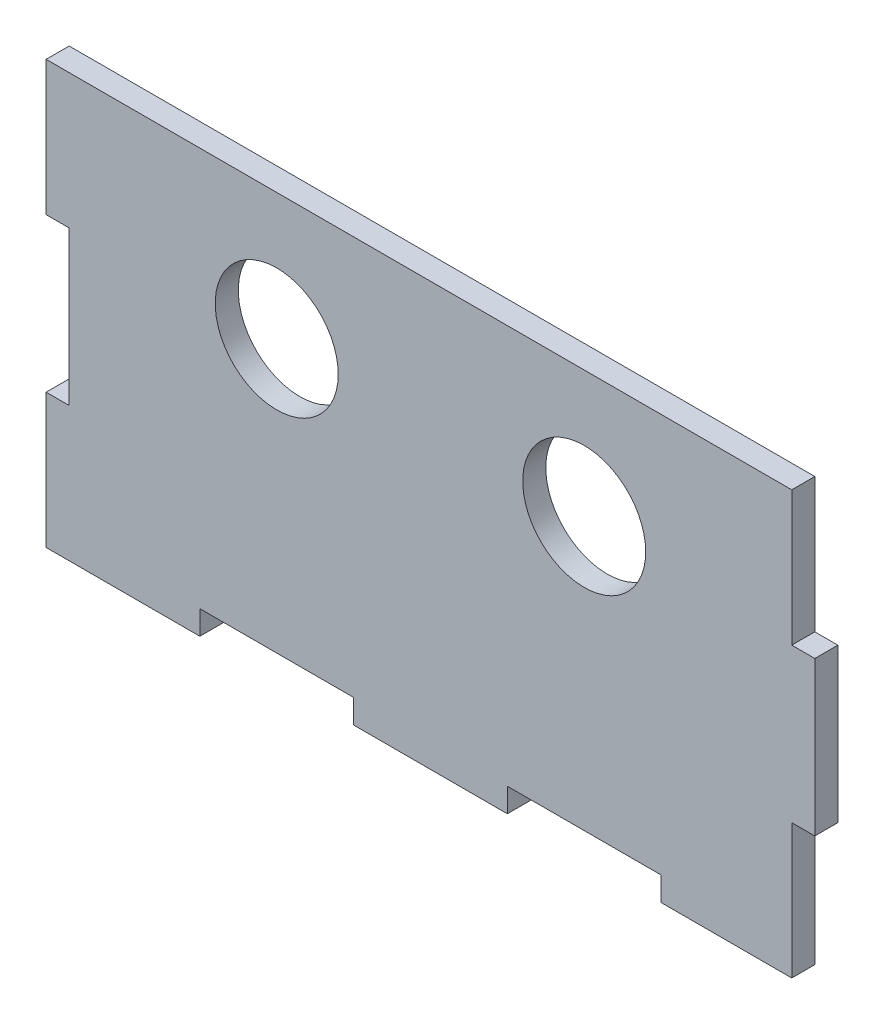
ISO-10303-21;
HEADER;
FILE_DESCRIPTION(('STEP AP214'),'2;1');
FILE_NAME('part.step','',(''),(''),'','','');
FILE_SCHEMA(('AUTOMOTIVE_DESIGN { 1 0 10303 214 1 1 1 1 }'));
ENDSEC;
DATA;
#1=APPLICATION_CONTEXT('core data for automotive mechanical design processes');
#2=APPLICATION_PROTOCOL_DEFINITION('international standard','automotive_design',2000,#1);
#3=PRODUCT_CONTEXT('',#1,'mechanical');
#4=PRODUCT('Part','Part','',(#3));
#5=PRODUCT_RELATED_PRODUCT_CATEGORY('part','',(#4));
#6=PRODUCT_DEFINITION_FORMATION('','',#4);
#7=PRODUCT_DEFINITION_CONTEXT('part definition',#1,'design');
#8=PRODUCT_DEFINITION('design','',#6,#7);
#9=PRODUCT_DEFINITION_SHAPE('','',#8);
#10=(LENGTH_UNIT() NAMED_UNIT(*) SI_UNIT(.MILLI.,.METRE.));
#11=(NAMED_UNIT(*) PLANE_ANGLE_UNIT() SI_UNIT($,.RADIAN.));
#12=(NAMED_UNIT(*) SI_UNIT($,.STERADIAN.) SOLID_ANGLE_UNIT());
#13=UNCERTAINTY_MEASURE_WITH_UNIT(LENGTH_MEASURE(1.E-05),#10,'distance_accuracy_value','');
#14=(GEOMETRIC_REPRESENTATION_CONTEXT(3) GLOBAL_UNCERTAINTY_ASSIGNED_CONTEXT((#13)) GLOBAL_UNIT_ASSIGNED_CONTEXT((#10,
#11,#12)) REPRESENTATION_CONTEXT('',''));
#15=CARTESIAN_POINT('',(0.,0.,0.));
#16=DIRECTION('',(0.,0.,1.));
#17=DIRECTION('',(1.,0.,0.));
#18=AXIS2_PLACEMENT_3D('',#15,#16,#17);
#19=CARTESIAN_POINT('',(0.,-24.3935030371176,3.));
#20=DIRECTION('',(0.,1.,0.));
#21=DIRECTION('',(0.,0.,1.));
#22=AXIS2_PLACEMENT_3D('',#19,#20,#21);
#23=PLANE('',#22);
#24=DIRECTION('',(1.,0.,0.));
#25=VECTOR('',#24,1.);
#26=CARTESIAN_POINT('',(0.,-24.3935030371176,0.));
#27=LINE('',#26,#25);
#28=CARTESIAN_POINT('',(10.,-24.3935030371176,0.));
#29=VERTEX_POINT('',#28);
#30=CARTESIAN_POINT('',(30.,-24.3935030371176,0.));
#31=VERTEX_POINT('',#30);
#32=EDGE_CURVE('E281',#29,#31,#27,.T.);
#33=ORIENTED_EDGE('',*,*,#32,.T.);
#34=DIRECTION('',(0.,0.,-1.));
#35=VECTOR('',#34,1.);
#36=CARTESIAN_POINT('',(30.,-24.3935030371176,3.));
#37=LINE('',#36,#35);
#38=CARTESIAN_POINT('',(30.,-24.3935030371176,3.));
#39=VERTEX_POINT('',#38);
#40=EDGE_CURVE('E11',#39,#31,#37,.T.);
#41=ORIENTED_EDGE('',*,*,#40,.F.);
#42=DIRECTION('',(1.,0.,0.));
#43=VECTOR('',#42,1.);
#44=CARTESIAN_POINT('',(0.,-24.3935030371176,3.));
#45=LINE('',#44,#43);
#46=CARTESIAN_POINT('',(10.,-24.3935030371176,3.));
#47=VERTEX_POINT('',#46);
#48=EDGE_CURVE('E215',#47,#39,#45,.T.);
#49=ORIENTED_EDGE('',*,*,#48,.F.);
#50=DIRECTION('',(0.,0.,-1.));
#51=VECTOR('',#50,1.);
#52=CARTESIAN_POINT('',(10.,-24.3935030371176,3.));
#53=LINE('',#52,#51);
#54=EDGE_CURVE('E203',#47,#29,#53,.T.);
#55=ORIENTED_EDGE('',*,*,#54,.T.);
#56=EDGE_LOOP('',(#33,#41,#49,#55));
#57=FACE_BOUND('',#56,.T.);
#58=ADVANCED_FACE('F36',(#57),#23,.F.);
#59=CARTESIAN_POINT('',(30.,0.,3.));
#60=DIRECTION('',(1.,0.,0.));
#61=DIRECTION('',(0.,0.,-1.));
#62=AXIS2_PLACEMENT_3D('',#59,#60,#61);
#63=PLANE('',#62);
#64=DIRECTION('',(0.,-1.,0.));
#65=VECTOR('',#64,1.);
#66=CARTESIAN_POINT('',(30.,0.,0.));
#67=LINE('',#66,#65);
#68=CARTESIAN_POINT('',(30.,-27.5,0.));
#69=VERTEX_POINT('',#68);
#70=EDGE_CURVE('E275',#31,#69,#67,.T.);
#71=ORIENTED_EDGE('',*,*,#70,.T.);
#72=DIRECTION('',(0.,0.,-1.));
#73=VECTOR('',#72,1.);
#74=CARTESIAN_POINT('',(30.,-27.5,3.));
#75=LINE('',#74,#73);
#76=CARTESIAN_POINT('',(30.,-27.5,3.));
#77=VERTEX_POINT('',#76);
#78=EDGE_CURVE('E45',#77,#69,#75,.T.);
#79=ORIENTED_EDGE('',*,*,#78,.F.);
#80=DIRECTION('',(0.,-1.,0.));
#81=VECTOR('',#80,1.);
#82=CARTESIAN_POINT('',(30.,0.,3.));
#83=LINE('',#82,#81);
#84=EDGE_CURVE('E132',#39,#77,#83,.T.);
#85=ORIENTED_EDGE('',*,*,#84,.F.);
#86=ORIENTED_EDGE('',*,*,#40,.T.);
#87=EDGE_LOOP('',(#71,#79,#85,#86));
#88=FACE_BOUND('',#87,.T.);
#89=ADVANCED_FACE('F405',(#88),#63,.F.);
#90=CARTESIAN_POINT('',(0.,-27.5,3.));
#91=DIRECTION('',(0.,1.,0.));
#92=DIRECTION('',(0.,0.,1.));
#93=AXIS2_PLACEMENT_3D('',#90,#91,#92);
#94=PLANE('',#93);
#95=DIRECTION('',(1.,0.,0.));
#96=VECTOR('',#95,1.);
#97=CARTESIAN_POINT('',(0.,-27.5,0.));
#98=LINE('',#97,#96);
#99=CARTESIAN_POINT('',(47.,-27.5,0.));
#100=VERTEX_POINT('',#99);
#101=EDGE_CURVE('E228',#69,#100,#98,.T.);
#102=ORIENTED_EDGE('',*,*,#101,.T.);
#103=DIRECTION('',(0.,0.,-1.));
#104=VECTOR('',#103,1.);
#105=CARTESIAN_POINT('',(47.,-27.5,3.));
#106=LINE('',#105,#104);
#107=CARTESIAN_POINT('',(47.,-27.5,3.));
#108=VERTEX_POINT('',#107);
#109=EDGE_CURVE('E265',#108,#100,#106,.T.);
#110=ORIENTED_EDGE('',*,*,#109,.F.);
#111=DIRECTION('',(1.,0.,0.));
#112=VECTOR('',#111,1.);
#113=CARTESIAN_POINT('',(0.,-27.5,3.));
#114=LINE('',#113,#112);
#115=EDGE_CURVE('E202',#77,#108,#114,.T.);
#116=ORIENTED_EDGE('',*,*,#115,.F.);
#117=ORIENTED_EDGE('',*,*,#78,.T.);
#118=EDGE_LOOP('',(#102,#110,#116,#117));
#119=FACE_BOUND('',#118,.T.);
#120=ADVANCED_FACE('F270',(#119),#94,.F.);
#121=CARTESIAN_POINT('',(47.,0.,3.));
#122=DIRECTION('',(1.,0.,0.));
#123=DIRECTION('',(0.,0.,-1.));
#124=AXIS2_PLACEMENT_3D('',#121,#122,#123);
#125=PLANE('',#124);
#126=DIRECTION('',(0.,-1.,0.));
#127=VECTOR('',#126,1.);
#128=CARTESIAN_POINT('',(47.,0.,0.));
#129=LINE('',#128,#127);
#130=CARTESIAN_POINT('',(47.,-10.,0.));
#131=VERTEX_POINT('',#130);
#132=EDGE_CURVE('E278',#131,#100,#129,.T.);
#133=ORIENTED_EDGE('',*,*,#132,.F.);
#134=DIRECTION('',(0.,0.,-1.));
#135=VECTOR('',#134,1.);
#136=CARTESIAN_POINT('',(47.,-10.,3.));
#137=LINE('',#136,#135);
#138=CARTESIAN_POINT('',(47.,-10.,3.));
#139=VERTEX_POINT('',#138);
#140=EDGE_CURVE('E263',#139,#131,#137,.T.);
#141=ORIENTED_EDGE('',*,*,#140,.F.);
#142=DIRECTION('',(0.,-1.,0.));
#143=VECTOR('',#142,1.);
#144=CARTESIAN_POINT('',(47.,0.,3.));
#145=LINE('',#144,#143);
#146=EDGE_CURVE('E209',#139,#108,#145,.T.);
#147=ORIENTED_EDGE('',*,*,#146,.T.);
#148=ORIENTED_EDGE('',*,*,#109,.T.);
#149=EDGE_LOOP('',(#133,#141,#147,#148));
#150=FACE_BOUND('',#149,.T.);
#151=ADVANCED_FACE('F347',(#150),#125,.T.);
#152=CARTESIAN_POINT('',(0.,-10.,3.));
#153=DIRECTION('',(0.,-1.,0.));
#154=DIRECTION('',(0.,0.,-1.));
#155=AXIS2_PLACEMENT_3D('',#152,#153,#154);
#156=PLANE('',#155);
#157=DIRECTION('',(-1.,0.,0.));
#158=VECTOR('',#157,1.);
#159=CARTESIAN_POINT('',(0.,-10.,0.));
#160=LINE('',#159,#158);
#161=CARTESIAN_POINT('',(50.,-10.,0.));
#162=VERTEX_POINT('',#161);
#163=EDGE_CURVE('E279',#162,#131,#160,.T.);
#164=ORIENTED_EDGE('',*,*,#163,.F.);
#165=DIRECTION('',(0.,0.,-1.));
#166=VECTOR('',#165,1.);
#167=CARTESIAN_POINT('',(50.,-10.,3.));
#168=LINE('',#167,#166);
#169=CARTESIAN_POINT('',(50.,-10.,3.));
#170=VERTEX_POINT('',#169);
#171=EDGE_CURVE('E261',#170,#162,#168,.T.);
#172=ORIENTED_EDGE('',*,*,#171,.F.);
#173=DIRECTION('',(-1.,0.,0.));
#174=VECTOR('',#173,1.);
#175=CARTESIAN_POINT('',(0.,-10.,3.));
#176=LINE('',#175,#174);
#177=EDGE_CURVE('E214',#170,#139,#176,.T.);
#178=ORIENTED_EDGE('',*,*,#177,.T.);
#179=ORIENTED_EDGE('',*,*,#140,.T.);
#180=EDGE_LOOP('',(#164,#172,#178,#179));
#181=FACE_BOUND('',#180,.T.);
#182=ADVANCED_FACE('F343',(#181),#156,.T.);
#183=CARTESIAN_POINT('',(50.,0.,3.));
#184=DIRECTION('',(-1.,0.,0.));
#185=DIRECTION('',(0.,0.,1.));
#186=AXIS2_PLACEMENT_3D('',#183,#184,#185);
#187=PLANE('',#186);
#188=DIRECTION('',(0.,1.,0.));
#189=VECTOR('',#188,1.);
#190=CARTESIAN_POINT('',(50.,0.,0.));
#191=LINE('',#190,#189);
#192=CARTESIAN_POINT('',(50.,10.,0.));
#193=VERTEX_POINT('',#192);
#194=EDGE_CURVE('E350',#162,#193,#191,.T.);
#195=ORIENTED_EDGE('',*,*,#194,.T.);
#196=DIRECTION('',(0.,0.,-1.));
#197=VECTOR('',#196,1.);
#198=CARTESIAN_POINT('',(50.,10.,3.));
#199=LINE('',#198,#197);
#200=CARTESIAN_POINT('',(50.,10.,3.));
#201=VERTEX_POINT('',#200);
#202=EDGE_CURVE('E258',#201,#193,#199,.T.);
#203=ORIENTED_EDGE('',*,*,#202,.F.);
#204=DIRECTION('',(0.,1.,0.));
#205=VECTOR('',#204,1.);
#206=CARTESIAN_POINT('',(50.,0.,3.));
#207=LINE('',#206,#205);
#208=EDGE_CURVE('E337',#170,#201,#207,.T.);
#209=ORIENTED_EDGE('',*,*,#208,.F.);
#210=ORIENTED_EDGE('',*,*,#171,.T.);
#211=EDGE_LOOP('',(#195,#203,#209,#210));
#212=FACE_BOUND('',#211,.T.);
#213=ADVANCED_FACE('F395',(#212),#187,.F.);
#214=CARTESIAN_POINT('',(0.,10.,3.));
#215=DIRECTION('',(0.,-1.,0.));
#216=DIRECTION('',(0.,0.,-1.));
#217=AXIS2_PLACEMENT_3D('',#214,#215,#216);
#218=PLANE('',#217);
#219=DIRECTION('',(-1.,0.,0.));
#220=VECTOR('',#219,1.);
#221=CARTESIAN_POINT('',(0.,10.,0.));
#222=LINE('',#221,#220);
#223=CARTESIAN_POINT('',(47.,10.,0.));
#224=VERTEX_POINT('',#223);
#225=EDGE_CURVE('E352',#193,#224,#222,.T.);
#226=ORIENTED_EDGE('',*,*,#225,.T.);
#227=DIRECTION('',(0.,0.,-1.));
#228=VECTOR('',#227,1.);
#229=CARTESIAN_POINT('',(47.,10.,3.));
#230=LINE('',#229,#228);
#231=CARTESIAN_POINT('',(47.,10.,3.));
#232=VERTEX_POINT('',#231);
#233=EDGE_CURVE('E255',#232,#224,#230,.T.);
#234=ORIENTED_EDGE('',*,*,#233,.F.);
#235=DIRECTION('',(-1.,0.,0.));
#236=VECTOR('',#235,1.);
#237=CARTESIAN_POINT('',(0.,10.,3.));
#238=LINE('',#237,#236);
#239=EDGE_CURVE('E335',#201,#232,#238,.T.);
#240=ORIENTED_EDGE('',*,*,#239,.F.);
#241=ORIENTED_EDGE('',*,*,#202,.T.);
#242=EDGE_LOOP('',(#226,#234,#240,#241));
#243=FACE_BOUND('',#242,.T.);
#244=ADVANCED_FACE('F393',(#243),#218,.F.);
#245=CARTESIAN_POINT('',(47.,0.,3.));
#246=DIRECTION('',(-1.,0.,0.));
#247=DIRECTION('',(0.,0.,1.));
#248=AXIS2_PLACEMENT_3D('',#245,#246,#247);
#249=PLANE('',#248);
#250=DIRECTION('',(0.,1.,0.));
#251=VECTOR('',#250,1.);
#252=CARTESIAN_POINT('',(47.,0.,0.));
#253=LINE('',#252,#251);
#254=CARTESIAN_POINT('',(47.,27.5,0.));
#255=VERTEX_POINT('',#254);
#256=EDGE_CURVE('E356',#224,#255,#253,.T.);
#257=ORIENTED_EDGE('',*,*,#256,.T.);
#258=DIRECTION('',(0.,0.,-1.));
#259=VECTOR('',#258,1.);
#260=CARTESIAN_POINT('',(47.,27.5,3.));
#261=LINE('',#260,#259);
#262=CARTESIAN_POINT('',(47.,27.5,3.));
#263=VERTEX_POINT('',#262);
#264=EDGE_CURVE('E253',#263,#255,#261,.T.);
#265=ORIENTED_EDGE('',*,*,#264,.F.);
#266=DIRECTION('',(0.,1.,0.));
#267=VECTOR('',#266,1.);
#268=CARTESIAN_POINT('',(47.,0.,3.));
#269=LINE('',#268,#267);
#270=EDGE_CURVE('E333',#232,#263,#269,.T.);
#271=ORIENTED_EDGE('',*,*,#270,.F.);
#272=ORIENTED_EDGE('',*,*,#233,.T.);
#273=EDGE_LOOP('',(#257,#265,#271,#272));
#274=FACE_BOUND('',#273,.T.);
#275=ADVANCED_FACE('F389',(#274),#249,.F.);
#276=CARTESIAN_POINT('',(0.,27.5,3.));
#277=DIRECTION('',(0.,1.,0.));
#278=DIRECTION('',(0.,0.,1.));
#279=AXIS2_PLACEMENT_3D('',#276,#277,#278);
#280=PLANE('',#279);
#281=DIRECTION('',(1.,0.,0.));
#282=VECTOR('',#281,1.);
#283=CARTESIAN_POINT('',(0.,27.5,0.));
#284=LINE('',#283,#282);
#285=CARTESIAN_POINT('',(-50.,27.5,0.));
#286=VERTEX_POINT('',#285);
#287=EDGE_CURVE('E359',#286,#255,#284,.T.);
#288=ORIENTED_EDGE('',*,*,#287,.F.);
#289=DIRECTION('',(0.,0.,-1.));
#290=VECTOR('',#289,1.);
#291=CARTESIAN_POINT('',(-50.,27.5,3.));
#292=LINE('',#291,#290);
#293=CARTESIAN_POINT('',(-50.,27.5,3.));
#294=VERTEX_POINT('',#293);
#295=EDGE_CURVE('E251',#294,#286,#292,.T.);
#296=ORIENTED_EDGE('',*,*,#295,.F.);
#297=DIRECTION('',(1.,0.,0.));
#298=VECTOR('',#297,1.);
#299=CARTESIAN_POINT('',(0.,27.5,3.));
#300=LINE('',#299,#298);
#301=EDGE_CURVE('E330',#294,#263,#300,.T.);
#302=ORIENTED_EDGE('',*,*,#301,.T.);
#303=ORIENTED_EDGE('',*,*,#264,.T.);
#304=EDGE_LOOP('',(#288,#296,#302,#303));
#305=FACE_BOUND('',#304,.T.);
#306=ADVANCED_FACE('F384',(#305),#280,.T.);
#307=CARTESIAN_POINT('',(-50.,0.,3.));
#308=DIRECTION('',(-1.,0.,0.));
#309=DIRECTION('',(0.,0.,1.));
#310=AXIS2_PLACEMENT_3D('',#307,#308,#309);
#311=PLANE('',#310);
#312=DIRECTION('',(0.,1.,0.));
#313=VECTOR('',#312,1.);
#314=CARTESIAN_POINT('',(-50.,0.,0.));
#315=LINE('',#314,#313);
#316=CARTESIAN_POINT('',(-50.,10.,0.));
#317=VERTEX_POINT('',#316);
#318=EDGE_CURVE('E362',#317,#286,#315,.T.);
#319=ORIENTED_EDGE('',*,*,#318,.F.);
#320=DIRECTION('',(0.,0.,-1.));
#321=VECTOR('',#320,1.);
#322=CARTESIAN_POINT('',(-50.,10.,3.));
#323=LINE('',#322,#321);
#324=CARTESIAN_POINT('',(-50.,10.,3.));
#325=VERTEX_POINT('',#324);
#326=EDGE_CURVE('E249',#325,#317,#323,.T.);
#327=ORIENTED_EDGE('',*,*,#326,.F.);
#328=DIRECTION('',(0.,1.,0.));
#329=VECTOR('',#328,1.);
#330=CARTESIAN_POINT('',(-50.,0.,3.));
#331=LINE('',#330,#329);
#332=EDGE_CURVE('E327',#325,#294,#331,.T.);
#333=ORIENTED_EDGE('',*,*,#332,.T.);
#334=ORIENTED_EDGE('',*,*,#295,.T.);
#335=EDGE_LOOP('',(#319,#327,#333,#334));
#336=FACE_BOUND('',#335,.T.);
#337=ADVANCED_FACE('F380',(#336),#311,.T.);
#338=CARTESIAN_POINT('',(0.,10.0000000000001,3.));
#339=DIRECTION('',(0.,-1.,0.));
#340=DIRECTION('',(1.,0.,0.));
#341=AXIS2_PLACEMENT_3D('',#338,#339,#340);
#342=PLANE('',#341);
#343=DIRECTION('',(-1.,0.,0.));
#344=VECTOR('',#343,1.);
#345=CARTESIAN_POINT('',(0.,10.0000000000001,0.));
#346=LINE('',#345,#344);
#347=CARTESIAN_POINT('',(-47.,10.,0.));
#348=VERTEX_POINT('',#347);
#349=EDGE_CURVE('E365',#348,#317,#346,.T.);
#350=ORIENTED_EDGE('',*,*,#349,.F.);
#351=DIRECTION('',(0.,0.,-1.));
#352=VECTOR('',#351,1.);
#353=CARTESIAN_POINT('',(-47.,10.,3.));
#354=LINE('',#353,#352);
#355=CARTESIAN_POINT('',(-47.,10.,3.));
#356=VERTEX_POINT('',#355);
#357=EDGE_CURVE('E247',#356,#348,#354,.T.);
#358=ORIENTED_EDGE('',*,*,#357,.F.);
#359=DIRECTION('',(-1.,0.,0.));
#360=VECTOR('',#359,1.);
#361=CARTESIAN_POINT('',(0.,10.0000000000001,3.));
#362=LINE('',#361,#360);
#363=EDGE_CURVE('E324',#356,#325,#362,.T.);
#364=ORIENTED_EDGE('',*,*,#363,.T.);
#365=ORIENTED_EDGE('',*,*,#326,.T.);
#366=EDGE_LOOP('',(#350,#358,#364,#365));
#367=FACE_BOUND('',#366,.T.);
#368=ADVANCED_FACE('F376',(#367),#342,.T.);
#369=CARTESIAN_POINT('',(-47.,0.,3.));
#370=DIRECTION('',(-1.,0.,0.));
#371=DIRECTION('',(0.,0.,1.));
#372=AXIS2_PLACEMENT_3D('',#369,#370,#371);
#373=PLANE('',#372);
#374=DIRECTION('',(0.,1.,0.));
#375=VECTOR('',#374,1.);
#376=CARTESIAN_POINT('',(-47.,0.,0.));
#377=LINE('',#376,#375);
#378=CARTESIAN_POINT('',(-47.,-10.,0.));
#379=VERTEX_POINT('',#378);
#380=EDGE_CURVE('E295',#379,#348,#377,.T.);
#381=ORIENTED_EDGE('',*,*,#380,.F.);
#382=DIRECTION('',(0.,0.,-1.));
#383=VECTOR('',#382,1.);
#384=CARTESIAN_POINT('',(-47.,-10.,3.));
#385=LINE('',#384,#383);
#386=CARTESIAN_POINT('',(-47.,-10.,3.));
#387=VERTEX_POINT('',#386);
#388=EDGE_CURVE('E245',#387,#379,#385,.T.);
#389=ORIENTED_EDGE('',*,*,#388,.F.);
#390=DIRECTION('',(0.,1.,0.));
#391=VECTOR('',#390,1.);
#392=CARTESIAN_POINT('',(-47.,0.,3.));
#393=LINE('',#392,#391);
#394=EDGE_CURVE('E321',#387,#356,#393,.T.);
#395=ORIENTED_EDGE('',*,*,#394,.T.);
#396=ORIENTED_EDGE('',*,*,#357,.T.);
#397=EDGE_LOOP('',(#381,#389,#395,#396));
#398=FACE_BOUND('',#397,.T.);
#399=ADVANCED_FACE('F372',(#398),#373,.T.);
#400=CARTESIAN_POINT('',(0.,-10.0000000000002,3.));
#401=DIRECTION('',(0.,1.,0.));
#402=DIRECTION('',(-1.,0.,0.));
#403=AXIS2_PLACEMENT_3D('',#400,#401,#402);
#404=PLANE('',#403);
#405=DIRECTION('',(1.,0.,0.));
#406=VECTOR('',#405,1.);
#407=CARTESIAN_POINT('',(0.,-10.0000000000002,0.));
#408=LINE('',#407,#406);
#409=CARTESIAN_POINT('',(-50.,-10.,0.));
#410=VERTEX_POINT('',#409);
#411=EDGE_CURVE('E291',#410,#379,#408,.T.);
#412=ORIENTED_EDGE('',*,*,#411,.F.);
#413=DIRECTION('',(0.,0.,-1.));
#414=VECTOR('',#413,1.);
#415=CARTESIAN_POINT('',(-50.,-10.,3.));
#416=LINE('',#415,#414);
#417=CARTESIAN_POINT('',(-50.,-10.,3.));
#418=VERTEX_POINT('',#417);
#419=EDGE_CURVE('E243',#418,#410,#416,.T.);
#420=ORIENTED_EDGE('',*,*,#419,.F.);
#421=DIRECTION('',(1.,0.,0.));
#422=VECTOR('',#421,1.);
#423=CARTESIAN_POINT('',(0.,-10.0000000000002,3.));
#424=LINE('',#423,#422);
#425=EDGE_CURVE('E318',#418,#387,#424,.T.);
#426=ORIENTED_EDGE('',*,*,#425,.T.);
#427=ORIENTED_EDGE('',*,*,#388,.T.);
#428=EDGE_LOOP('',(#412,#420,#426,#427));
#429=FACE_BOUND('',#428,.T.);
#430=ADVANCED_FACE('F448',(#429),#404,.T.);
#431=CARTESIAN_POINT('',(-50.,0.,3.));
#432=DIRECTION('',(-1.,0.,0.));
#433=DIRECTION('',(0.,0.,1.));
#434=AXIS2_PLACEMENT_3D('',#431,#432,#433);
#435=PLANE('',#434);
#436=DIRECTION('',(0.,1.,0.));
#437=VECTOR('',#436,1.);
#438=CARTESIAN_POINT('',(-50.,0.,0.));
#439=LINE('',#438,#437);
#440=CARTESIAN_POINT('',(-50.,-27.5,0.));
#441=VERTEX_POINT('',#440);
#442=EDGE_CURVE('E284',#441,#410,#439,.T.);
#443=ORIENTED_EDGE('',*,*,#442,.F.);
#444=DIRECTION('',(0.,0.,-1.));
#445=VECTOR('',#444,1.);
#446=CARTESIAN_POINT('',(-50.,-27.5,3.));
#447=LINE('',#446,#445);
#448=CARTESIAN_POINT('',(-50.,-27.5,3.));
#449=VERTEX_POINT('',#448);
#450=EDGE_CURVE('E241',#449,#441,#447,.T.);
#451=ORIENTED_EDGE('',*,*,#450,.F.);
#452=DIRECTION('',(0.,1.,0.));
#453=VECTOR('',#452,1.);
#454=CARTESIAN_POINT('',(-50.,0.,3.));
#455=LINE('',#454,#453);
#456=EDGE_CURVE('E208',#449,#418,#455,.T.);
#457=ORIENTED_EDGE('',*,*,#456,.T.);
#458=ORIENTED_EDGE('',*,*,#419,.T.);
#459=EDGE_LOOP('',(#443,#451,#457,#458));
#460=FACE_BOUND('',#459,.T.);
#461=ADVANCED_FACE('F445',(#460),#435,.T.);
#462=CARTESIAN_POINT('',(-30.,-27.5,0.));
#463=VERTEX_POINT('',#462);
#464=EDGE_CURVE('E227',#441,#463,#98,.T.);
#465=ORIENTED_EDGE('',*,*,#464,.T.);
#466=DIRECTION('',(0.,0.,-1.));
#467=VECTOR('',#466,1.);
#468=CARTESIAN_POINT('',(-30.,-27.5,3.));
#469=LINE('',#468,#467);
#470=CARTESIAN_POINT('',(-30.,-27.5,3.));
#471=VERTEX_POINT('',#470);
#472=EDGE_CURVE('E238',#471,#463,#469,.T.);
#473=ORIENTED_EDGE('',*,*,#472,.F.);
#474=EDGE_CURVE('E201',#449,#471,#114,.T.);
#475=ORIENTED_EDGE('',*,*,#474,.F.);
#476=ORIENTED_EDGE('',*,*,#450,.T.);
#477=EDGE_LOOP('',(#465,#473,#475,#476));
#478=FACE_BOUND('',#477,.T.);
#479=ADVANCED_FACE('F421',(#478),#94,.F.);
#480=CARTESIAN_POINT('',(-30.,0.,3.));
#481=DIRECTION('',(-1.,0.,0.));
#482=DIRECTION('',(0.,0.,1.));
#483=AXIS2_PLACEMENT_3D('',#480,#481,#482);
#484=PLANE('',#483);
#485=DIRECTION('',(0.,1.,0.));
#486=VECTOR('',#485,1.);
#487=CARTESIAN_POINT('',(-30.,0.,0.));
#488=LINE('',#487,#486);
#489=CARTESIAN_POINT('',(-30.,-24.3935030371176,0.));
#490=VERTEX_POINT('',#489);
#491=EDGE_CURVE('E283',#463,#490,#488,.T.);
#492=ORIENTED_EDGE('',*,*,#491,.T.);
#493=DIRECTION('',(0.,0.,-1.));
#494=VECTOR('',#493,1.);
#495=CARTESIAN_POINT('',(-30.,-24.3935030371176,3.));
#496=LINE('',#495,#494);
#497=CARTESIAN_POINT('',(-30.,-24.3935030371176,3.));
#498=VERTEX_POINT('',#497);
#499=EDGE_CURVE('E235',#498,#490,#496,.T.);
#500=ORIENTED_EDGE('',*,*,#499,.F.);
#501=DIRECTION('',(0.,1.,0.));
#502=VECTOR('',#501,1.);
#503=CARTESIAN_POINT('',(-30.,0.,3.));
#504=LINE('',#503,#502);
#505=EDGE_CURVE('E207',#471,#498,#504,.T.);
#506=ORIENTED_EDGE('',*,*,#505,.F.);
#507=ORIENTED_EDGE('',*,*,#472,.T.);
#508=EDGE_LOOP('',(#492,#500,#506,#507));
#509=FACE_BOUND('',#508,.T.);
#510=ADVANCED_FACE('F441',(#509),#484,.F.);
#511=CARTESIAN_POINT('',(0.,-24.3935030371176,3.));
#512=DIRECTION('',(0.,1.,0.));
#513=DIRECTION('',(0.,0.,1.));
#514=AXIS2_PLACEMENT_3D('',#511,#512,#513);
#515=PLANE('',#514);
#516=DIRECTION('',(1.,0.,0.));
#517=VECTOR('',#516,1.);
#518=CARTESIAN_POINT('',(0.,-24.3935030371176,0.));
#519=LINE('',#518,#517);
#520=CARTESIAN_POINT('',(-10.,-24.3935030371176,0.));
#521=VERTEX_POINT('',#520);
#522=EDGE_CURVE('E288',#490,#521,#519,.T.);
#523=ORIENTED_EDGE('',*,*,#522,.T.);
#524=DIRECTION('',(0.,0.,-1.));
#525=VECTOR('',#524,1.);
#526=CARTESIAN_POINT('',(-10.,-24.3935030371176,3.));
#527=LINE('',#526,#525);
#528=CARTESIAN_POINT('',(-10.,-24.3935030371176,3.));
#529=VERTEX_POINT('',#528);
#530=EDGE_CURVE('E196',#529,#521,#527,.T.);
#531=ORIENTED_EDGE('',*,*,#530,.F.);
#532=DIRECTION('',(1.,0.,0.));
#533=VECTOR('',#532,1.);
#534=CARTESIAN_POINT('',(0.,-24.3935030371176,3.));
#535=LINE('',#534,#533);
#536=EDGE_CURVE('E187',#498,#529,#535,.T.);
#537=ORIENTED_EDGE('',*,*,#536,.F.);
#538=ORIENTED_EDGE('',*,*,#499,.T.);
#539=EDGE_LOOP('',(#523,#531,#537,#538));
#540=FACE_BOUND('',#539,.T.);
#541=ADVANCED_FACE('F300',(#540),#515,.F.);
#542=CARTESIAN_POINT('',(-10.,0.,3.));
#543=DIRECTION('',(1.,0.,0.));
#544=DIRECTION('',(0.,0.,-1.));
#545=AXIS2_PLACEMENT_3D('',#542,#543,#544);
#546=PLANE('',#545);
#547=DIRECTION('',(0.,-1.,0.));
#548=VECTOR('',#547,1.);
#549=CARTESIAN_POINT('',(-10.,0.,0.));
#550=LINE('',#549,#548);
#551=CARTESIAN_POINT('',(-10.,-27.5,0.));
#552=VERTEX_POINT('',#551);
#553=EDGE_CURVE('E195',#521,#552,#550,.T.);
#554=ORIENTED_EDGE('',*,*,#553,.T.);
#555=DIRECTION('',(0.,0.,-1.));
#556=VECTOR('',#555,1.);
#557=CARTESIAN_POINT('',(-10.,-27.5,3.));
#558=LINE('',#557,#556);
#559=CARTESIAN_POINT('',(-10.,-27.5,3.));
#560=VERTEX_POINT('',#559);
#561=EDGE_CURVE('E192',#560,#552,#558,.T.);
#562=ORIENTED_EDGE('',*,*,#561,.F.);
#563=DIRECTION('',(0.,-1.,0.));
#564=VECTOR('',#563,1.);
#565=CARTESIAN_POINT('',(-10.,0.,3.));
#566=LINE('',#565,#564);
#567=EDGE_CURVE('E181',#529,#560,#566,.T.);
#568=ORIENTED_EDGE('',*,*,#567,.F.);
#569=ORIENTED_EDGE('',*,*,#530,.T.);
#570=EDGE_LOOP('',(#554,#562,#568,#569));
#571=FACE_BOUND('',#570,.T.);
#572=ADVANCED_FACE('F193',(#571),#546,.F.);
#573=CARTESIAN_POINT('',(10.,-27.5,0.));
#574=VERTEX_POINT('',#573);
#575=EDGE_CURVE('E118',#552,#574,#98,.T.);
#576=ORIENTED_EDGE('',*,*,#575,.T.);
#577=DIRECTION('',(0.,0.,-1.));
#578=VECTOR('',#577,1.);
#579=CARTESIAN_POINT('',(10.,-27.5,3.));
#580=LINE('',#579,#578);
#581=CARTESIAN_POINT('',(10.,-27.5,3.));
#582=VERTEX_POINT('',#581);
#583=EDGE_CURVE('E197',#582,#574,#580,.T.);
#584=ORIENTED_EDGE('',*,*,#583,.F.);
#585=EDGE_CURVE('E185',#560,#582,#114,.T.);
#586=ORIENTED_EDGE('',*,*,#585,.F.);
#587=ORIENTED_EDGE('',*,*,#561,.T.);
#588=EDGE_LOOP('',(#576,#584,#586,#587));
#589=FACE_BOUND('',#588,.T.);
#590=ADVANCED_FACE('F199',(#589),#94,.F.);
#591=CARTESIAN_POINT('',(-20.,11.,3.));
#592=DIRECTION('',(0.,0.,-1.));
#593=DIRECTION('',(-1.,0.,0.));
#594=AXIS2_PLACEMENT_3D('',#591,#592,#593);
#595=CYLINDRICAL_SURFACE('',#594,8.);
#596=CARTESIAN_POINT('',(-20.,11.,3.));
#597=DIRECTION('',(0.,0.,1.));
#598=DIRECTION('',(1.,0.,0.));
#599=AXIS2_PLACEMENT_3D('',#596,#597,#598);
#600=CIRCLE('',#599,8.);
#601=CARTESIAN_POINT('',(-12.,11.,3.));
#602=VERTEX_POINT('',#601);
#603=EDGE_CURVE('E216',#602,#602,#600,.T.);
#604=ORIENTED_EDGE('',*,*,#603,.T.);
#605=EDGE_LOOP('',(#604));
#606=FACE_BOUND('',#605,.T.);
#607=CARTESIAN_POINT('',(-20.,11.,0.));
#608=DIRECTION('',(0.,0.,1.));
#609=DIRECTION('',(1.,0.,0.));
#610=AXIS2_PLACEMENT_3D('',#607,#608,#609);
#611=CIRCLE('',#610,8.);
#612=CARTESIAN_POINT('',(-12.,11.,0.));
#613=VERTEX_POINT('',#612);
#614=EDGE_CURVE('E306',#613,#613,#611,.T.);
#615=ORIENTED_EDGE('',*,*,#614,.F.);
#616=EDGE_LOOP('',(#615));
#617=FACE_BOUND('',#616,.T.);
#618=ADVANCED_FACE('F412',(#606,#617),#595,.F.);
#619=CARTESIAN_POINT('',(20.,11.,3.));
#620=DIRECTION('',(0.,0.,-1.));
#621=DIRECTION('',(-1.,0.,0.));
#622=AXIS2_PLACEMENT_3D('',#619,#620,#621);
#623=CYLINDRICAL_SURFACE('',#622,8.00000000000001);
#624=CARTESIAN_POINT('',(20.,11.,3.));
#625=DIRECTION('',(0.,0.,1.));
#626=DIRECTION('',(1.,0.,0.));
#627=AXIS2_PLACEMENT_3D('',#624,#625,#626);
#628=CIRCLE('',#627,8.00000000000001);
#629=CARTESIAN_POINT('',(28.,11.,3.));
#630=VERTEX_POINT('',#629);
#631=EDGE_CURVE('E221',#630,#630,#628,.T.);
#632=ORIENTED_EDGE('',*,*,#631,.T.);
#633=EDGE_LOOP('',(#632));
#634=FACE_BOUND('',#633,.T.);
#635=CARTESIAN_POINT('',(20.,11.,0.));
#636=DIRECTION('',(0.,0.,1.));
#637=DIRECTION('',(1.,0.,0.));
#638=AXIS2_PLACEMENT_3D('',#635,#636,#637);
#639=CIRCLE('',#638,8.00000000000001);
#640=CARTESIAN_POINT('',(28.,11.,0.));
#641=VERTEX_POINT('',#640);
#642=EDGE_CURVE('E309',#641,#641,#639,.T.);
#643=ORIENTED_EDGE('',*,*,#642,.F.);
#644=EDGE_LOOP('',(#643));
#645=FACE_BOUND('',#644,.T.);
#646=ADVANCED_FACE('F38',(#634,#645),#623,.F.);
#647=CARTESIAN_POINT('',(10.,0.,3.));
#648=DIRECTION('',(-1.,0.,0.));
#649=DIRECTION('',(0.,0.,1.));
#650=AXIS2_PLACEMENT_3D('',#647,#648,#649);
#651=PLANE('',#650);
#652=DIRECTION('',(0.,1.,0.));
#653=VECTOR('',#652,1.);
#654=CARTESIAN_POINT('',(10.,0.,0.));
#655=LINE('',#654,#653);
#656=EDGE_CURVE('E124',#574,#29,#655,.T.);
#657=ORIENTED_EDGE('',*,*,#656,.T.);
#658=ORIENTED_EDGE('',*,*,#54,.F.);
#659=DIRECTION('',(0.,1.,0.));
#660=VECTOR('',#659,1.);
#661=CARTESIAN_POINT('',(10.,0.,3.));
#662=LINE('',#661,#660);
#663=EDGE_CURVE('E53',#582,#47,#662,.T.);
#664=ORIENTED_EDGE('',*,*,#663,.F.);
#665=ORIENTED_EDGE('',*,*,#583,.T.);
#666=EDGE_LOOP('',(#657,#658,#664,#665));
#667=FACE_BOUND('',#666,.T.);
#668=ADVANCED_FACE('F419',(#667),#651,.F.);
#669=CARTESIAN_POINT('',(0.,0.,3.));
#670=DIRECTION('',(0.,0.,1.));
#671=DIRECTION('',(1.,0.,0.));
#672=AXIS2_PLACEMENT_3D('',#669,#670,#671);
#673=PLANE('',#672);
#674=ORIENTED_EDGE('',*,*,#631,.F.);
#675=EDGE_LOOP('',(#674));
#676=FACE_BOUND('',#675,.T.);
#677=ORIENTED_EDGE('',*,*,#603,.F.);
#678=EDGE_LOOP('',(#677));
#679=FACE_BOUND('',#678,.T.);
#680=ORIENTED_EDGE('',*,*,#48,.T.);
#681=ORIENTED_EDGE('',*,*,#84,.T.);
#682=ORIENTED_EDGE('',*,*,#115,.T.);
#683=ORIENTED_EDGE('',*,*,#146,.F.);
#684=ORIENTED_EDGE('',*,*,#177,.F.);
#685=ORIENTED_EDGE('',*,*,#208,.T.);
#686=ORIENTED_EDGE('',*,*,#239,.T.);
#687=ORIENTED_EDGE('',*,*,#270,.T.);
#688=ORIENTED_EDGE('',*,*,#301,.F.);
#689=ORIENTED_EDGE('',*,*,#332,.F.);
#690=ORIENTED_EDGE('',*,*,#363,.F.);
#691=ORIENTED_EDGE('',*,*,#394,.F.);
#692=ORIENTED_EDGE('',*,*,#425,.F.);
#693=ORIENTED_EDGE('',*,*,#456,.F.);
#694=ORIENTED_EDGE('',*,*,#474,.T.);
#695=ORIENTED_EDGE('',*,*,#505,.T.);
#696=ORIENTED_EDGE('',*,*,#536,.T.);
#697=ORIENTED_EDGE('',*,*,#567,.T.);
#698=ORIENTED_EDGE('',*,*,#585,.T.);
#699=ORIENTED_EDGE('',*,*,#663,.T.);
#700=EDGE_LOOP('',(#680,#681,#682,#683,#684,#685,#686,#687,#688,#689,#690,#691,#692,#693,#694,
#695,#696,#697,#698,#699));
#701=FACE_BOUND('',#700,.T.);
#702=ADVANCED_FACE('F183',(#676,#679,#701),#673,.T.);
#703=CARTESIAN_POINT('',(0.,0.,0.));
#704=DIRECTION('',(0.,0.,1.));
#705=DIRECTION('',(1.,0.,0.));
#706=AXIS2_PLACEMENT_3D('',#703,#704,#705);
#707=PLANE('',#706);
#708=ORIENTED_EDGE('',*,*,#642,.T.);
#709=EDGE_LOOP('',(#708));
#710=FACE_BOUND('',#709,.T.);
#711=ORIENTED_EDGE('',*,*,#614,.T.);
#712=EDGE_LOOP('',(#711));
#713=FACE_BOUND('',#712,.T.);
#714=ORIENTED_EDGE('',*,*,#32,.F.);
#715=ORIENTED_EDGE('',*,*,#656,.F.);
#716=ORIENTED_EDGE('',*,*,#575,.F.);
#717=ORIENTED_EDGE('',*,*,#553,.F.);
#718=ORIENTED_EDGE('',*,*,#522,.F.);
#719=ORIENTED_EDGE('',*,*,#491,.F.);
#720=ORIENTED_EDGE('',*,*,#464,.F.);
#721=ORIENTED_EDGE('',*,*,#442,.T.);
#722=ORIENTED_EDGE('',*,*,#411,.T.);
#723=ORIENTED_EDGE('',*,*,#380,.T.);
#724=ORIENTED_EDGE('',*,*,#349,.T.);
#725=ORIENTED_EDGE('',*,*,#318,.T.);
#726=ORIENTED_EDGE('',*,*,#287,.T.);
#727=ORIENTED_EDGE('',*,*,#256,.F.);
#728=ORIENTED_EDGE('',*,*,#225,.F.);
#729=ORIENTED_EDGE('',*,*,#194,.F.);
#730=ORIENTED_EDGE('',*,*,#163,.T.);
#731=ORIENTED_EDGE('',*,*,#132,.T.);
#732=ORIENTED_EDGE('',*,*,#101,.F.);
#733=ORIENTED_EDGE('',*,*,#70,.F.);
#734=EDGE_LOOP('',(#714,#715,#716,#717,#718,#719,#720,#721,#722,#723,#724,#725,#726,#727,#728,
#729,#730,#731,#732,#733));
#735=FACE_BOUND('',#734,.T.);
#736=ADVANCED_FACE('F274',(#710,#713,#735),#707,.F.);
#737=CLOSED_SHELL('',(#58,#89,#120,#151,#182,#213,#244,#275,#306,#337,#368,#399,#430,#461,#479,
#510,#541,#572,#590,#618,#646,#668,#702,#736));
#738=MANIFOLD_SOLID_BREP('B2',#737);
#739=ADVANCED_BREP_SHAPE_REPRESENTATION('',(#18,#738),#14);
#740=SHAPE_DEFINITION_REPRESENTATION(#9,#739);
ENDSEC;
END-ISO-10303-21;
